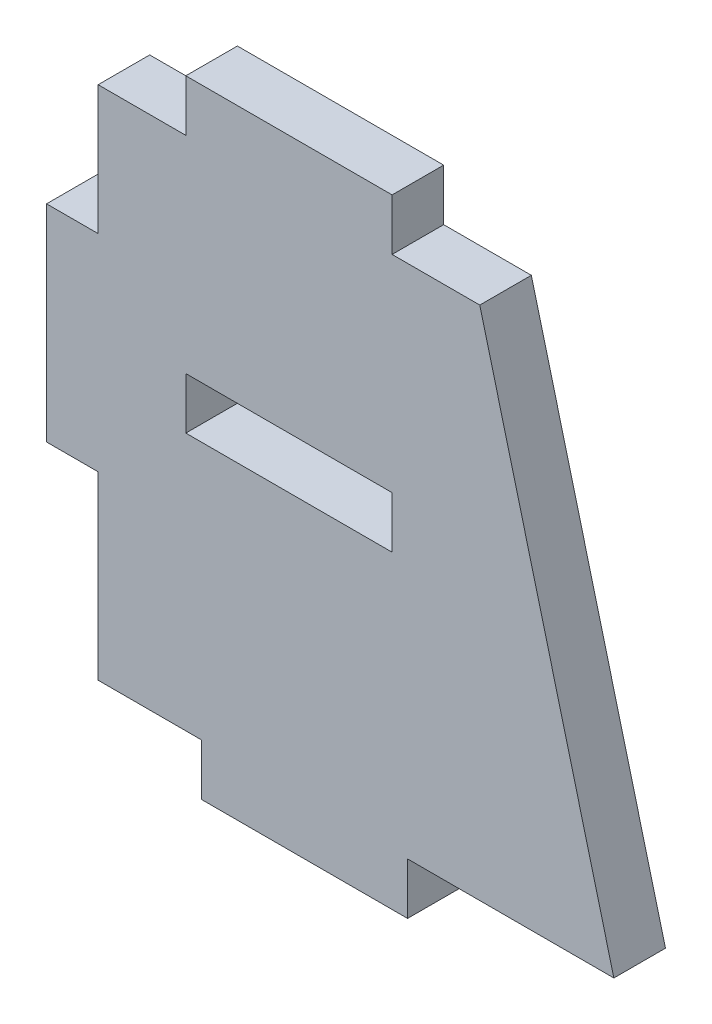
ISO-10303-21;
HEADER;
FILE_DESCRIPTION(('STEP AP214'),'2;1');
FILE_NAME('part.step','',(''),(''),'','','');
FILE_SCHEMA(('AUTOMOTIVE_DESIGN { 1 0 10303 214 1 1 1 1 }'));
ENDSEC;
DATA;
#1=APPLICATION_CONTEXT('core data for automotive mechanical design processes');
#2=APPLICATION_PROTOCOL_DEFINITION('international standard','automotive_design',2000,#1);
#3=PRODUCT_CONTEXT('',#1,'mechanical');
#4=PRODUCT('Part','Part','',(#3));
#5=PRODUCT_RELATED_PRODUCT_CATEGORY('part','',(#4));
#6=PRODUCT_DEFINITION_FORMATION('','',#4);
#7=PRODUCT_DEFINITION_CONTEXT('part definition',#1,'design');
#8=PRODUCT_DEFINITION('design','',#6,#7);
#9=PRODUCT_DEFINITION_SHAPE('','',#8);
#10=(LENGTH_UNIT() NAMED_UNIT(*) SI_UNIT(.MILLI.,.METRE.));
#11=(NAMED_UNIT(*) PLANE_ANGLE_UNIT() SI_UNIT($,.RADIAN.));
#12=(NAMED_UNIT(*) SI_UNIT($,.STERADIAN.) SOLID_ANGLE_UNIT());
#13=UNCERTAINTY_MEASURE_WITH_UNIT(LENGTH_MEASURE(1.E-05),#10,'distance_accuracy_value','');
#14=(GEOMETRIC_REPRESENTATION_CONTEXT(3) GLOBAL_UNCERTAINTY_ASSIGNED_CONTEXT((#13)) GLOBAL_UNIT_ASSIGNED_CONTEXT((#10,
#11,#12)) REPRESENTATION_CONTEXT('',''));
#15=CARTESIAN_POINT('',(0.,0.,0.));
#16=DIRECTION('',(0.,0.,1.));
#17=DIRECTION('',(1.,0.,0.));
#18=AXIS2_PLACEMENT_3D('',#15,#16,#17);
#19=CARTESIAN_POINT('',(6.35,6.35,6.35));
#20=DIRECTION('',(0.,0.,1.));
#21=DIRECTION('',(1.,0.,0.));
#22=AXIS2_PLACEMENT_3D('',#19,#20,#21);
#23=PLANE('',#22);
#24=DIRECTION('',(0.,-1.,0.));
#25=VECTOR('',#24,1.);
#26=CARTESIAN_POINT('',(6.35000000000001,28.575,6.35));
#27=LINE('',#26,#25);
#28=CARTESIAN_POINT('',(6.35000000000001,28.575,6.35));
#29=VERTEX_POINT('',#28);
#30=CARTESIAN_POINT('',(6.35,6.35,6.35));
#31=VERTEX_POINT('',#30);
#32=EDGE_CURVE('E204',#29,#31,#27,.T.);
#33=ORIENTED_EDGE('',*,*,#32,.T.);
#34=DIRECTION('',(1.,0.,0.));
#35=VECTOR('',#34,1.);
#36=CARTESIAN_POINT('',(6.35,6.35,6.35));
#37=LINE('',#36,#35);
#38=CARTESIAN_POINT('',(19.05,6.34999999999999,6.35));
#39=VERTEX_POINT('',#38);
#40=EDGE_CURVE('E207',#31,#39,#37,.T.);
#41=ORIENTED_EDGE('',*,*,#40,.T.);
#42=DIRECTION('',(0.,-1.,0.));
#43=VECTOR('',#42,1.);
#44=CARTESIAN_POINT('',(19.05,6.34999999999999,6.35));
#45=LINE('',#44,#43);
#46=CARTESIAN_POINT('',(19.05,0.,6.35));
#47=VERTEX_POINT('',#46);
#48=EDGE_CURVE('E210',#39,#47,#45,.T.);
#49=ORIENTED_EDGE('',*,*,#48,.T.);
#50=DIRECTION('',(1.,0.,0.));
#51=VECTOR('',#50,1.);
#52=CARTESIAN_POINT('',(19.05,0.,6.35));
#53=LINE('',#52,#51);
#54=CARTESIAN_POINT('',(44.45,0.,6.35));
#55=VERTEX_POINT('',#54);
#56=EDGE_CURVE('E212',#47,#55,#53,.T.);
#57=ORIENTED_EDGE('',*,*,#56,.T.);
#58=DIRECTION('',(0.,1.,0.));
#59=VECTOR('',#58,1.);
#60=CARTESIAN_POINT('',(44.45,0.,6.35));
#61=LINE('',#60,#59);
#62=CARTESIAN_POINT('',(44.45,6.35,6.35));
#63=VERTEX_POINT('',#62);
#64=EDGE_CURVE('E214',#55,#63,#61,.T.);
#65=ORIENTED_EDGE('',*,*,#64,.T.);
#66=DIRECTION('',(1.,0.,0.));
#67=VECTOR('',#66,1.);
#68=CARTESIAN_POINT('',(44.45,6.35,6.35));
#69=LINE('',#68,#67);
#70=CARTESIAN_POINT('',(69.85,6.35,6.35));
#71=VERTEX_POINT('',#70);
#72=EDGE_CURVE('E216',#63,#71,#69,.T.);
#73=ORIENTED_EDGE('',*,*,#72,.T.);
#74=DIRECTION('',(-0.251633851764951,0.967822506788272,0.));
#75=VECTOR('',#74,1.);
#76=CARTESIAN_POINT('',(69.85,6.35,6.35));
#77=LINE('',#76,#75);
#78=CARTESIAN_POINT('',(53.34,69.85,6.35));
#79=VERTEX_POINT('',#78);
#80=EDGE_CURVE('E218',#71,#79,#77,.T.);
#81=ORIENTED_EDGE('',*,*,#80,.T.);
#82=DIRECTION('',(-1.,0.,0.));
#83=VECTOR('',#82,1.);
#84=CARTESIAN_POINT('',(42.545,69.85,6.35));
#85=LINE('',#84,#83);
#86=CARTESIAN_POINT('',(42.545,69.85,6.35));
#87=VERTEX_POINT('',#86);
#88=EDGE_CURVE('E220',#79,#87,#85,.T.);
#89=ORIENTED_EDGE('',*,*,#88,.T.);
#90=DIRECTION('',(0.,1.,0.));
#91=VECTOR('',#90,1.);
#92=CARTESIAN_POINT('',(42.545,76.2,6.35));
#93=LINE('',#92,#91);
#94=CARTESIAN_POINT('',(42.545,76.2,6.35));
#95=VERTEX_POINT('',#94);
#96=EDGE_CURVE('E222',#87,#95,#93,.T.);
#97=ORIENTED_EDGE('',*,*,#96,.T.);
#98=DIRECTION('',(-1.,0.,0.));
#99=VECTOR('',#98,1.);
#100=CARTESIAN_POINT('',(17.145,76.2,6.35));
#101=LINE('',#100,#99);
#102=CARTESIAN_POINT('',(17.145,76.2,6.35));
#103=VERTEX_POINT('',#102);
#104=EDGE_CURVE('E224',#95,#103,#101,.T.);
#105=ORIENTED_EDGE('',*,*,#104,.T.);
#106=DIRECTION('',(0.,-1.,0.));
#107=VECTOR('',#106,1.);
#108=CARTESIAN_POINT('',(17.145,69.85,6.35));
#109=LINE('',#108,#107);
#110=CARTESIAN_POINT('',(17.145,69.85,6.35));
#111=VERTEX_POINT('',#110);
#112=EDGE_CURVE('E226',#103,#111,#109,.T.);
#113=ORIENTED_EDGE('',*,*,#112,.T.);
#114=DIRECTION('',(-1.,0.,0.));
#115=VECTOR('',#114,1.);
#116=CARTESIAN_POINT('',(6.34999999999999,69.85,6.35));
#117=LINE('',#116,#115);
#118=CARTESIAN_POINT('',(6.34999999999999,69.85,6.35));
#119=VERTEX_POINT('',#118);
#120=EDGE_CURVE('E228',#111,#119,#117,.T.);
#121=ORIENTED_EDGE('',*,*,#120,.T.);
#122=DIRECTION('',(0.,-1.,0.));
#123=VECTOR('',#122,1.);
#124=CARTESIAN_POINT('',(6.34999999999999,69.85,6.35));
#125=LINE('',#124,#123);
#126=CARTESIAN_POINT('',(6.35,53.975,6.35));
#127=VERTEX_POINT('',#126);
#128=EDGE_CURVE('E230',#119,#127,#125,.T.);
#129=ORIENTED_EDGE('',*,*,#128,.T.);
#130=DIRECTION('',(-1.,0.,0.));
#131=VECTOR('',#130,1.);
#132=CARTESIAN_POINT('',(0.,53.975,6.35));
#133=LINE('',#132,#131);
#134=CARTESIAN_POINT('',(0.,53.975,6.35));
#135=VERTEX_POINT('',#134);
#136=EDGE_CURVE('E232',#127,#135,#133,.T.);
#137=ORIENTED_EDGE('',*,*,#136,.T.);
#138=DIRECTION('',(0.,-1.,0.));
#139=VECTOR('',#138,1.);
#140=CARTESIAN_POINT('',(0.,28.575,6.35));
#141=LINE('',#140,#139);
#142=CARTESIAN_POINT('',(0.,28.575,6.35));
#143=VERTEX_POINT('',#142);
#144=EDGE_CURVE('E234',#135,#143,#141,.T.);
#145=ORIENTED_EDGE('',*,*,#144,.T.);
#146=DIRECTION('',(1.,0.,0.));
#147=VECTOR('',#146,1.);
#148=CARTESIAN_POINT('',(6.35000000000001,28.575,6.35));
#149=LINE('',#148,#147);
#150=EDGE_CURVE('E236',#143,#29,#149,.T.);
#151=ORIENTED_EDGE('',*,*,#150,.T.);
#152=EDGE_LOOP('',(#33,#41,#49,#57,#65,#73,#81,#89,#97,#105,#113,#121,#129,#137,#145,#151));
#153=FACE_BOUND('',#152,.T.);
#154=DIRECTION('',(1.,0.,0.));
#155=VECTOR('',#154,1.);
#156=CARTESIAN_POINT('',(17.145,38.1,6.35));
#157=LINE('',#156,#155);
#158=CARTESIAN_POINT('',(17.145,38.1,6.35));
#159=VERTEX_POINT('',#158);
#160=CARTESIAN_POINT('',(42.545,38.1,6.35));
#161=VERTEX_POINT('',#160);
#162=EDGE_CURVE('E176',#159,#161,#157,.T.);
#163=ORIENTED_EDGE('',*,*,#162,.F.);
#164=DIRECTION('',(0.,-1.,0.));
#165=VECTOR('',#164,1.);
#166=CARTESIAN_POINT('',(17.145,44.45,6.35));
#167=LINE('',#166,#165);
#168=CARTESIAN_POINT('',(17.145,44.45,6.35));
#169=VERTEX_POINT('',#168);
#170=EDGE_CURVE('E168',#169,#159,#167,.T.);
#171=ORIENTED_EDGE('',*,*,#170,.F.);
#172=DIRECTION('',(-1.,0.,0.));
#173=VECTOR('',#172,1.);
#174=CARTESIAN_POINT('',(17.145,44.45,6.35));
#175=LINE('',#174,#173);
#176=CARTESIAN_POINT('',(42.545,44.45,6.35));
#177=VERTEX_POINT('',#176);
#178=EDGE_CURVE('E190',#177,#169,#175,.T.);
#179=ORIENTED_EDGE('',*,*,#178,.F.);
#180=DIRECTION('',(0.,1.,0.));
#181=VECTOR('',#180,1.);
#182=CARTESIAN_POINT('',(42.545,44.45,6.35));
#183=LINE('',#182,#181);
#184=EDGE_CURVE('E188',#161,#177,#183,.T.);
#185=ORIENTED_EDGE('',*,*,#184,.F.);
#186=EDGE_LOOP('',(#163,#171,#179,#185));
#187=FACE_BOUND('',#186,.T.);
#188=ADVANCED_FACE('F31',(#153,#187),#23,.T.);
#189=CARTESIAN_POINT('',(6.35,6.35,0.));
#190=DIRECTION('',(0.,0.,1.));
#191=DIRECTION('',(1.,0.,0.));
#192=AXIS2_PLACEMENT_3D('',#189,#190,#191);
#193=PLANE('',#192);
#194=DIRECTION('',(0.,-1.,0.));
#195=VECTOR('',#194,1.);
#196=CARTESIAN_POINT('',(6.35000000000001,28.575,0.));
#197=LINE('',#196,#195);
#198=CARTESIAN_POINT('',(6.35000000000001,28.575,0.));
#199=VERTEX_POINT('',#198);
#200=CARTESIAN_POINT('',(6.35,6.35,0.));
#201=VERTEX_POINT('',#200);
#202=EDGE_CURVE('E184',#199,#201,#197,.T.);
#203=ORIENTED_EDGE('',*,*,#202,.F.);
#204=DIRECTION('',(1.,0.,0.));
#205=VECTOR('',#204,1.);
#206=CARTESIAN_POINT('',(6.35000000000001,28.575,0.));
#207=LINE('',#206,#205);
#208=CARTESIAN_POINT('',(0.,28.575,0.));
#209=VERTEX_POINT('',#208);
#210=EDGE_CURVE('E208',#209,#199,#207,.T.);
#211=ORIENTED_EDGE('',*,*,#210,.F.);
#212=DIRECTION('',(0.,-1.,0.));
#213=VECTOR('',#212,1.);
#214=CARTESIAN_POINT('',(0.,28.575,0.));
#215=LINE('',#214,#213);
#216=CARTESIAN_POINT('',(0.,53.975,0.));
#217=VERTEX_POINT('',#216);
#218=EDGE_CURVE('E267',#217,#209,#215,.T.);
#219=ORIENTED_EDGE('',*,*,#218,.F.);
#220=DIRECTION('',(-1.,0.,0.));
#221=VECTOR('',#220,1.);
#222=CARTESIAN_POINT('',(0.,53.975,0.));
#223=LINE('',#222,#221);
#224=CARTESIAN_POINT('',(6.35,53.975,0.));
#225=VERTEX_POINT('',#224);
#226=EDGE_CURVE('E265',#225,#217,#223,.T.);
#227=ORIENTED_EDGE('',*,*,#226,.F.);
#228=DIRECTION('',(0.,-1.,0.));
#229=VECTOR('',#228,1.);
#230=CARTESIAN_POINT('',(6.34999999999999,69.85,0.));
#231=LINE('',#230,#229);
#232=CARTESIAN_POINT('',(6.34999999999999,69.85,0.));
#233=VERTEX_POINT('',#232);
#234=EDGE_CURVE('E263',#233,#225,#231,.T.);
#235=ORIENTED_EDGE('',*,*,#234,.F.);
#236=DIRECTION('',(-1.,0.,0.));
#237=VECTOR('',#236,1.);
#238=CARTESIAN_POINT('',(6.34999999999999,69.85,0.));
#239=LINE('',#238,#237);
#240=CARTESIAN_POINT('',(17.145,69.85,0.));
#241=VERTEX_POINT('',#240);
#242=EDGE_CURVE('E261',#241,#233,#239,.T.);
#243=ORIENTED_EDGE('',*,*,#242,.F.);
#244=DIRECTION('',(0.,-1.,0.));
#245=VECTOR('',#244,1.);
#246=CARTESIAN_POINT('',(17.145,69.85,0.));
#247=LINE('',#246,#245);
#248=CARTESIAN_POINT('',(17.145,76.2,0.));
#249=VERTEX_POINT('',#248);
#250=EDGE_CURVE('E259',#249,#241,#247,.T.);
#251=ORIENTED_EDGE('',*,*,#250,.F.);
#252=DIRECTION('',(-1.,0.,0.));
#253=VECTOR('',#252,1.);
#254=CARTESIAN_POINT('',(17.145,76.2,0.));
#255=LINE('',#254,#253);
#256=CARTESIAN_POINT('',(42.545,76.2,0.));
#257=VERTEX_POINT('',#256);
#258=EDGE_CURVE('E257',#257,#249,#255,.T.);
#259=ORIENTED_EDGE('',*,*,#258,.F.);
#260=DIRECTION('',(0.,1.,0.));
#261=VECTOR('',#260,1.);
#262=CARTESIAN_POINT('',(42.545,76.2,0.));
#263=LINE('',#262,#261);
#264=CARTESIAN_POINT('',(42.545,69.85,0.));
#265=VERTEX_POINT('',#264);
#266=EDGE_CURVE('E255',#265,#257,#263,.T.);
#267=ORIENTED_EDGE('',*,*,#266,.F.);
#268=DIRECTION('',(-1.,0.,0.));
#269=VECTOR('',#268,1.);
#270=CARTESIAN_POINT('',(42.545,69.85,0.));
#271=LINE('',#270,#269);
#272=CARTESIAN_POINT('',(53.34,69.85,0.));
#273=VERTEX_POINT('',#272);
#274=EDGE_CURVE('E253',#273,#265,#271,.T.);
#275=ORIENTED_EDGE('',*,*,#274,.F.);
#276=DIRECTION('',(-0.251633851764951,0.967822506788272,0.));
#277=VECTOR('',#276,1.);
#278=CARTESIAN_POINT('',(69.85,6.35,0.));
#279=LINE('',#278,#277);
#280=CARTESIAN_POINT('',(69.85,6.35,0.));
#281=VERTEX_POINT('',#280);
#282=EDGE_CURVE('E251',#281,#273,#279,.T.);
#283=ORIENTED_EDGE('',*,*,#282,.F.);
#284=DIRECTION('',(1.,0.,0.));
#285=VECTOR('',#284,1.);
#286=CARTESIAN_POINT('',(44.45,6.35,0.));
#287=LINE('',#286,#285);
#288=CARTESIAN_POINT('',(44.45,6.35,0.));
#289=VERTEX_POINT('',#288);
#290=EDGE_CURVE('E249',#289,#281,#287,.T.);
#291=ORIENTED_EDGE('',*,*,#290,.F.);
#292=DIRECTION('',(0.,1.,0.));
#293=VECTOR('',#292,1.);
#294=CARTESIAN_POINT('',(44.45,0.,0.));
#295=LINE('',#294,#293);
#296=CARTESIAN_POINT('',(44.45,0.,0.));
#297=VERTEX_POINT('',#296);
#298=EDGE_CURVE('E247',#297,#289,#295,.T.);
#299=ORIENTED_EDGE('',*,*,#298,.F.);
#300=DIRECTION('',(1.,0.,0.));
#301=VECTOR('',#300,1.);
#302=CARTESIAN_POINT('',(19.05,0.,0.));
#303=LINE('',#302,#301);
#304=CARTESIAN_POINT('',(19.05,0.,0.));
#305=VERTEX_POINT('',#304);
#306=EDGE_CURVE('E245',#305,#297,#303,.T.);
#307=ORIENTED_EDGE('',*,*,#306,.F.);
#308=DIRECTION('',(0.,-1.,0.));
#309=VECTOR('',#308,1.);
#310=CARTESIAN_POINT('',(19.05,6.34999999999999,0.));
#311=LINE('',#310,#309);
#312=CARTESIAN_POINT('',(19.05,6.34999999999999,0.));
#313=VERTEX_POINT('',#312);
#314=EDGE_CURVE('E243',#313,#305,#311,.T.);
#315=ORIENTED_EDGE('',*,*,#314,.F.);
#316=DIRECTION('',(1.,0.,0.));
#317=VECTOR('',#316,1.);
#318=CARTESIAN_POINT('',(6.35,6.35,0.));
#319=LINE('',#318,#317);
#320=EDGE_CURVE('E241',#201,#313,#319,.T.);
#321=ORIENTED_EDGE('',*,*,#320,.F.);
#322=EDGE_LOOP('',(#203,#211,#219,#227,#235,#243,#251,#259,#267,#275,#283,#291,#299,#307,#315,#321));
#323=FACE_BOUND('',#322,.T.);
#324=DIRECTION('',(0.,-1.,0.));
#325=VECTOR('',#324,1.);
#326=CARTESIAN_POINT('',(17.145,44.45,0.));
#327=LINE('',#326,#325);
#328=CARTESIAN_POINT('',(17.145,44.45,0.));
#329=VERTEX_POINT('',#328);
#330=CARTESIAN_POINT('',(17.145,38.1,0.));
#331=VERTEX_POINT('',#330);
#332=EDGE_CURVE('E54',#329,#331,#327,.T.);
#333=ORIENTED_EDGE('',*,*,#332,.T.);
#334=DIRECTION('',(1.,0.,0.));
#335=VECTOR('',#334,1.);
#336=CARTESIAN_POINT('',(17.145,38.1,0.));
#337=LINE('',#336,#335);
#338=CARTESIAN_POINT('',(42.545,38.1,0.));
#339=VERTEX_POINT('',#338);
#340=EDGE_CURVE('E183',#331,#339,#337,.T.);
#341=ORIENTED_EDGE('',*,*,#340,.T.);
#342=DIRECTION('',(0.,1.,0.));
#343=VECTOR('',#342,1.);
#344=CARTESIAN_POINT('',(42.545,44.45,0.));
#345=LINE('',#344,#343);
#346=CARTESIAN_POINT('',(42.545,44.45,0.));
#347=VERTEX_POINT('',#346);
#348=EDGE_CURVE('E196',#339,#347,#345,.T.);
#349=ORIENTED_EDGE('',*,*,#348,.T.);
#350=DIRECTION('',(-1.,0.,0.));
#351=VECTOR('',#350,1.);
#352=CARTESIAN_POINT('',(17.145,44.45,0.));
#353=LINE('',#352,#351);
#354=EDGE_CURVE('E177',#347,#329,#353,.T.);
#355=ORIENTED_EDGE('',*,*,#354,.T.);
#356=EDGE_LOOP('',(#333,#341,#349,#355));
#357=FACE_BOUND('',#356,.T.);
#358=ADVANCED_FACE('F321',(#323,#357),#193,.F.);
#359=CARTESIAN_POINT('',(6.35000000000001,28.575,6.35));
#360=DIRECTION('',(1.,0.,0.));
#361=DIRECTION('',(0.,1.,0.));
#362=AXIS2_PLACEMENT_3D('',#359,#360,#361);
#363=PLANE('',#362);
#364=ORIENTED_EDGE('',*,*,#202,.T.);
#365=DIRECTION('',(0.,0.,-1.));
#366=VECTOR('',#365,1.);
#367=CARTESIAN_POINT('',(6.35,6.35,6.35));
#368=LINE('',#367,#366);
#369=EDGE_CURVE('E11',#31,#201,#368,.T.);
#370=ORIENTED_EDGE('',*,*,#369,.F.);
#371=ORIENTED_EDGE('',*,*,#32,.F.);
#372=DIRECTION('',(0.,0.,-1.));
#373=VECTOR('',#372,1.);
#374=CARTESIAN_POINT('',(6.35000000000001,28.575,6.35));
#375=LINE('',#374,#373);
#376=EDGE_CURVE('E238',#29,#199,#375,.T.);
#377=ORIENTED_EDGE('',*,*,#376,.T.);
#378=EDGE_LOOP('',(#364,#370,#371,#377));
#379=FACE_BOUND('',#378,.T.);
#380=ADVANCED_FACE('F33',(#379),#363,.F.);
#381=CARTESIAN_POINT('',(6.35,6.35,6.35));
#382=DIRECTION('',(0.,1.,0.));
#383=DIRECTION('',(-1.,0.,0.));
#384=AXIS2_PLACEMENT_3D('',#381,#382,#383);
#385=PLANE('',#384);
#386=ORIENTED_EDGE('',*,*,#320,.T.);
#387=DIRECTION('',(0.,0.,-1.));
#388=VECTOR('',#387,1.);
#389=CARTESIAN_POINT('',(19.05,6.34999999999999,6.35));
#390=LINE('',#389,#388);
#391=EDGE_CURVE('E39',#39,#313,#390,.T.);
#392=ORIENTED_EDGE('',*,*,#391,.F.);
#393=ORIENTED_EDGE('',*,*,#40,.F.);
#394=ORIENTED_EDGE('',*,*,#369,.T.);
#395=EDGE_LOOP('',(#386,#392,#393,#394));
#396=FACE_BOUND('',#395,.T.);
#397=ADVANCED_FACE('F338',(#396),#385,.F.);
#398=CARTESIAN_POINT('',(19.05,6.34999999999999,6.35));
#399=DIRECTION('',(1.,0.,0.));
#400=DIRECTION('',(0.,0.,-1.));
#401=AXIS2_PLACEMENT_3D('',#398,#399,#400);
#402=PLANE('',#401);
#403=ORIENTED_EDGE('',*,*,#314,.T.);
#404=DIRECTION('',(0.,0.,-1.));
#405=VECTOR('',#404,1.);
#406=CARTESIAN_POINT('',(19.05,0.,6.35));
#407=LINE('',#406,#405);
#408=EDGE_CURVE('E308',#47,#305,#407,.T.);
#409=ORIENTED_EDGE('',*,*,#408,.F.);
#410=ORIENTED_EDGE('',*,*,#48,.F.);
#411=ORIENTED_EDGE('',*,*,#391,.T.);
#412=EDGE_LOOP('',(#403,#409,#410,#411));
#413=FACE_BOUND('',#412,.T.);
#414=ADVANCED_FACE('F315',(#413),#402,.F.);
#415=CARTESIAN_POINT('',(19.05,0.,6.35));
#416=DIRECTION('',(0.,1.,0.));
#417=DIRECTION('',(-1.,0.,0.));
#418=AXIS2_PLACEMENT_3D('',#415,#416,#417);
#419=PLANE('',#418);
#420=ORIENTED_EDGE('',*,*,#306,.T.);
#421=DIRECTION('',(0.,0.,-1.));
#422=VECTOR('',#421,1.);
#423=CARTESIAN_POINT('',(44.45,0.,6.35));
#424=LINE('',#423,#422);
#425=EDGE_CURVE('E305',#55,#297,#424,.T.);
#426=ORIENTED_EDGE('',*,*,#425,.F.);
#427=ORIENTED_EDGE('',*,*,#56,.F.);
#428=ORIENTED_EDGE('',*,*,#408,.T.);
#429=EDGE_LOOP('',(#420,#426,#427,#428));
#430=FACE_BOUND('',#429,.T.);
#431=ADVANCED_FACE('F327',(#430),#419,.F.);
#432=CARTESIAN_POINT('',(44.45,0.,6.35));
#433=DIRECTION('',(-1.,0.,0.));
#434=DIRECTION('',(0.,0.,1.));
#435=AXIS2_PLACEMENT_3D('',#432,#433,#434);
#436=PLANE('',#435);
#437=ORIENTED_EDGE('',*,*,#298,.T.);
#438=DIRECTION('',(0.,0.,-1.));
#439=VECTOR('',#438,1.);
#440=CARTESIAN_POINT('',(44.45,6.35,6.35));
#441=LINE('',#440,#439);
#442=EDGE_CURVE('E302',#63,#289,#441,.T.);
#443=ORIENTED_EDGE('',*,*,#442,.F.);
#444=ORIENTED_EDGE('',*,*,#64,.F.);
#445=ORIENTED_EDGE('',*,*,#425,.T.);
#446=EDGE_LOOP('',(#437,#443,#444,#445));
#447=FACE_BOUND('',#446,.T.);
#448=ADVANCED_FACE('F331',(#447),#436,.F.);
#449=CARTESIAN_POINT('',(44.45,6.35,6.35));
#450=DIRECTION('',(0.,1.,0.));
#451=DIRECTION('',(0.,0.,1.));
#452=AXIS2_PLACEMENT_3D('',#449,#450,#451);
#453=PLANE('',#452);
#454=ORIENTED_EDGE('',*,*,#290,.T.);
#455=DIRECTION('',(0.,0.,-1.));
#456=VECTOR('',#455,1.);
#457=CARTESIAN_POINT('',(69.85,6.35,6.35));
#458=LINE('',#457,#456);
#459=EDGE_CURVE('E299',#71,#281,#458,.T.);
#460=ORIENTED_EDGE('',*,*,#459,.F.);
#461=ORIENTED_EDGE('',*,*,#72,.F.);
#462=ORIENTED_EDGE('',*,*,#442,.T.);
#463=EDGE_LOOP('',(#454,#460,#461,#462));
#464=FACE_BOUND('',#463,.T.);
#465=ADVANCED_FACE('F391',(#464),#453,.F.);
#466=CARTESIAN_POINT('',(69.85,6.35,6.35));
#467=DIRECTION('',(-0.967822506788272,-0.251633851764951,0.));
#468=DIRECTION('',(0.251633851764951,-0.967822506788272,0.));
#469=AXIS2_PLACEMENT_3D('',#466,#467,#468);
#470=PLANE('',#469);
#471=ORIENTED_EDGE('',*,*,#282,.T.);
#472=DIRECTION('',(0.,0.,-1.));
#473=VECTOR('',#472,1.);
#474=CARTESIAN_POINT('',(53.34,69.85,6.35));
#475=LINE('',#474,#473);
#476=EDGE_CURVE('E296',#79,#273,#475,.T.);
#477=ORIENTED_EDGE('',*,*,#476,.F.);
#478=ORIENTED_EDGE('',*,*,#80,.F.);
#479=ORIENTED_EDGE('',*,*,#459,.T.);
#480=EDGE_LOOP('',(#471,#477,#478,#479));
#481=FACE_BOUND('',#480,.T.);
#482=ADVANCED_FACE('F388',(#481),#470,.F.);
#483=CARTESIAN_POINT('',(42.545,69.85,6.35));
#484=DIRECTION('',(0.,-1.,0.));
#485=DIRECTION('',(0.,0.,-1.));
#486=AXIS2_PLACEMENT_3D('',#483,#484,#485);
#487=PLANE('',#486);
#488=ORIENTED_EDGE('',*,*,#274,.T.);
#489=DIRECTION('',(0.,0.,-1.));
#490=VECTOR('',#489,1.);
#491=CARTESIAN_POINT('',(42.545,69.85,6.35));
#492=LINE('',#491,#490);
#493=EDGE_CURVE('E293',#87,#265,#492,.T.);
#494=ORIENTED_EDGE('',*,*,#493,.F.);
#495=ORIENTED_EDGE('',*,*,#88,.F.);
#496=ORIENTED_EDGE('',*,*,#476,.T.);
#497=EDGE_LOOP('',(#488,#494,#495,#496));
#498=FACE_BOUND('',#497,.T.);
#499=ADVANCED_FACE('F384',(#498),#487,.F.);
#500=CARTESIAN_POINT('',(42.545,76.2,6.35));
#501=DIRECTION('',(-1.,0.,0.));
#502=DIRECTION('',(0.,0.,1.));
#503=AXIS2_PLACEMENT_3D('',#500,#501,#502);
#504=PLANE('',#503);
#505=ORIENTED_EDGE('',*,*,#266,.T.);
#506=DIRECTION('',(0.,0.,-1.));
#507=VECTOR('',#506,1.);
#508=CARTESIAN_POINT('',(42.545,76.2,6.35));
#509=LINE('',#508,#507);
#510=EDGE_CURVE('E290',#95,#257,#509,.T.);
#511=ORIENTED_EDGE('',*,*,#510,.F.);
#512=ORIENTED_EDGE('',*,*,#96,.F.);
#513=ORIENTED_EDGE('',*,*,#493,.T.);
#514=EDGE_LOOP('',(#505,#511,#512,#513));
#515=FACE_BOUND('',#514,.T.);
#516=ADVANCED_FACE('F380',(#515),#504,.F.);
#517=CARTESIAN_POINT('',(17.145,76.2,6.35));
#518=DIRECTION('',(0.,-1.,0.));
#519=DIRECTION('',(0.,0.,-1.));
#520=AXIS2_PLACEMENT_3D('',#517,#518,#519);
#521=PLANE('',#520);
#522=ORIENTED_EDGE('',*,*,#258,.T.);
#523=DIRECTION('',(0.,0.,-1.));
#524=VECTOR('',#523,1.);
#525=CARTESIAN_POINT('',(17.145,76.2,6.35));
#526=LINE('',#525,#524);
#527=EDGE_CURVE('E287',#103,#249,#526,.T.);
#528=ORIENTED_EDGE('',*,*,#527,.F.);
#529=ORIENTED_EDGE('',*,*,#104,.F.);
#530=ORIENTED_EDGE('',*,*,#510,.T.);
#531=EDGE_LOOP('',(#522,#528,#529,#530));
#532=FACE_BOUND('',#531,.T.);
#533=ADVANCED_FACE('F375',(#532),#521,.F.);
#534=CARTESIAN_POINT('',(17.145,69.85,6.35));
#535=DIRECTION('',(1.,0.,0.));
#536=DIRECTION('',(0.,0.,-1.));
#537=AXIS2_PLACEMENT_3D('',#534,#535,#536);
#538=PLANE('',#537);
#539=ORIENTED_EDGE('',*,*,#250,.T.);
#540=DIRECTION('',(0.,0.,-1.));
#541=VECTOR('',#540,1.);
#542=CARTESIAN_POINT('',(17.145,69.85,6.35));
#543=LINE('',#542,#541);
#544=EDGE_CURVE('E284',#111,#241,#543,.T.);
#545=ORIENTED_EDGE('',*,*,#544,.F.);
#546=ORIENTED_EDGE('',*,*,#112,.F.);
#547=ORIENTED_EDGE('',*,*,#527,.T.);
#548=EDGE_LOOP('',(#539,#545,#546,#547));
#549=FACE_BOUND('',#548,.T.);
#550=ADVANCED_FACE('F369',(#549),#538,.F.);
#551=CARTESIAN_POINT('',(6.34999999999999,69.85,6.35));
#552=DIRECTION('',(0.,-1.,0.));
#553=DIRECTION('',(0.,0.,-1.));
#554=AXIS2_PLACEMENT_3D('',#551,#552,#553);
#555=PLANE('',#554);
#556=ORIENTED_EDGE('',*,*,#242,.T.);
#557=DIRECTION('',(0.,0.,-1.));
#558=VECTOR('',#557,1.);
#559=CARTESIAN_POINT('',(6.34999999999999,69.85,6.35));
#560=LINE('',#559,#558);
#561=EDGE_CURVE('E281',#119,#233,#560,.T.);
#562=ORIENTED_EDGE('',*,*,#561,.F.);
#563=ORIENTED_EDGE('',*,*,#120,.F.);
#564=ORIENTED_EDGE('',*,*,#544,.T.);
#565=EDGE_LOOP('',(#556,#562,#563,#564));
#566=FACE_BOUND('',#565,.T.);
#567=ADVANCED_FACE('F365',(#566),#555,.F.);
#568=CARTESIAN_POINT('',(6.34999999999999,69.85,6.35));
#569=DIRECTION('',(1.,0.,0.));
#570=DIRECTION('',(0.,1.,0.));
#571=AXIS2_PLACEMENT_3D('',#568,#569,#570);
#572=PLANE('',#571);
#573=ORIENTED_EDGE('',*,*,#234,.T.);
#574=DIRECTION('',(0.,0.,-1.));
#575=VECTOR('',#574,1.);
#576=CARTESIAN_POINT('',(6.35,53.975,6.35));
#577=LINE('',#576,#575);
#578=EDGE_CURVE('E278',#127,#225,#577,.T.);
#579=ORIENTED_EDGE('',*,*,#578,.F.);
#580=ORIENTED_EDGE('',*,*,#128,.F.);
#581=ORIENTED_EDGE('',*,*,#561,.T.);
#582=EDGE_LOOP('',(#573,#579,#580,#581));
#583=FACE_BOUND('',#582,.T.);
#584=ADVANCED_FACE('F360',(#583),#572,.F.);
#585=CARTESIAN_POINT('',(0.,53.975,6.35));
#586=DIRECTION('',(0.,-1.,0.));
#587=DIRECTION('',(0.,0.,-1.));
#588=AXIS2_PLACEMENT_3D('',#585,#586,#587);
#589=PLANE('',#588);
#590=ORIENTED_EDGE('',*,*,#226,.T.);
#591=DIRECTION('',(0.,0.,-1.));
#592=VECTOR('',#591,1.);
#593=CARTESIAN_POINT('',(0.,53.975,6.35));
#594=LINE('',#593,#592);
#595=EDGE_CURVE('E275',#135,#217,#594,.T.);
#596=ORIENTED_EDGE('',*,*,#595,.F.);
#597=ORIENTED_EDGE('',*,*,#136,.F.);
#598=ORIENTED_EDGE('',*,*,#578,.T.);
#599=EDGE_LOOP('',(#590,#596,#597,#598));
#600=FACE_BOUND('',#599,.T.);
#601=ADVANCED_FACE('F354',(#600),#589,.F.);
#602=CARTESIAN_POINT('',(0.,28.575,6.35));
#603=DIRECTION('',(1.,0.,0.));
#604=DIRECTION('',(0.,1.,0.));
#605=AXIS2_PLACEMENT_3D('',#602,#603,#604);
#606=PLANE('',#605);
#607=ORIENTED_EDGE('',*,*,#218,.T.);
#608=DIRECTION('',(0.,0.,-1.));
#609=VECTOR('',#608,1.);
#610=CARTESIAN_POINT('',(0.,28.575,6.35));
#611=LINE('',#610,#609);
#612=EDGE_CURVE('E272',#143,#209,#611,.T.);
#613=ORIENTED_EDGE('',*,*,#612,.F.);
#614=ORIENTED_EDGE('',*,*,#144,.F.);
#615=ORIENTED_EDGE('',*,*,#595,.T.);
#616=EDGE_LOOP('',(#607,#613,#614,#615));
#617=FACE_BOUND('',#616,.T.);
#618=ADVANCED_FACE('F350',(#617),#606,.F.);
#619=CARTESIAN_POINT('',(6.35000000000001,28.575,6.35));
#620=DIRECTION('',(0.,1.,0.));
#621=DIRECTION('',(0.,0.,1.));
#622=AXIS2_PLACEMENT_3D('',#619,#620,#621);
#623=PLANE('',#622);
#624=ORIENTED_EDGE('',*,*,#210,.T.);
#625=ORIENTED_EDGE('',*,*,#376,.F.);
#626=ORIENTED_EDGE('',*,*,#150,.F.);
#627=ORIENTED_EDGE('',*,*,#612,.T.);
#628=EDGE_LOOP('',(#624,#625,#626,#627));
#629=FACE_BOUND('',#628,.T.);
#630=ADVANCED_FACE('F345',(#629),#623,.F.);
#631=CARTESIAN_POINT('',(17.145,44.45,6.35));
#632=DIRECTION('',(1.,0.,0.));
#633=DIRECTION('',(0.,0.,-1.));
#634=AXIS2_PLACEMENT_3D('',#631,#632,#633);
#635=PLANE('',#634);
#636=ORIENTED_EDGE('',*,*,#332,.F.);
#637=DIRECTION('',(0.,0.,-1.));
#638=VECTOR('',#637,1.);
#639=CARTESIAN_POINT('',(17.145,44.45,6.35));
#640=LINE('',#639,#638);
#641=EDGE_CURVE('E172',#169,#329,#640,.T.);
#642=ORIENTED_EDGE('',*,*,#641,.F.);
#643=ORIENTED_EDGE('',*,*,#170,.T.);
#644=DIRECTION('',(0.,0.,-1.));
#645=VECTOR('',#644,1.);
#646=CARTESIAN_POINT('',(17.145,38.1,6.35));
#647=LINE('',#646,#645);
#648=EDGE_CURVE('E171',#159,#331,#647,.T.);
#649=ORIENTED_EDGE('',*,*,#648,.T.);
#650=EDGE_LOOP('',(#636,#642,#643,#649));
#651=FACE_BOUND('',#650,.T.);
#652=ADVANCED_FACE('F170',(#651),#635,.T.);
#653=CARTESIAN_POINT('',(17.145,38.1,6.35));
#654=DIRECTION('',(0.,1.,0.));
#655=DIRECTION('',(0.,0.,1.));
#656=AXIS2_PLACEMENT_3D('',#653,#654,#655);
#657=PLANE('',#656);
#658=ORIENTED_EDGE('',*,*,#340,.F.);
#659=ORIENTED_EDGE('',*,*,#648,.F.);
#660=ORIENTED_EDGE('',*,*,#162,.T.);
#661=DIRECTION('',(0.,0.,-1.));
#662=VECTOR('',#661,1.);
#663=CARTESIAN_POINT('',(42.545,38.1,6.35));
#664=LINE('',#663,#662);
#665=EDGE_CURVE('E185',#161,#339,#664,.T.);
#666=ORIENTED_EDGE('',*,*,#665,.T.);
#667=EDGE_LOOP('',(#658,#659,#660,#666));
#668=FACE_BOUND('',#667,.T.);
#669=ADVANCED_FACE('F180',(#668),#657,.T.);
#670=CARTESIAN_POINT('',(42.545,44.45,6.35));
#671=DIRECTION('',(-1.,0.,0.));
#672=DIRECTION('',(0.,0.,1.));
#673=AXIS2_PLACEMENT_3D('',#670,#671,#672);
#674=PLANE('',#673);
#675=ORIENTED_EDGE('',*,*,#348,.F.);
#676=ORIENTED_EDGE('',*,*,#665,.F.);
#677=ORIENTED_EDGE('',*,*,#184,.T.);
#678=DIRECTION('',(0.,0.,-1.));
#679=VECTOR('',#678,1.);
#680=CARTESIAN_POINT('',(42.545,44.45,6.35));
#681=LINE('',#680,#679);
#682=EDGE_CURVE('E46',#177,#347,#681,.T.);
#683=ORIENTED_EDGE('',*,*,#682,.T.);
#684=EDGE_LOOP('',(#675,#676,#677,#683));
#685=FACE_BOUND('',#684,.T.);
#686=ADVANCED_FACE('F473',(#685),#674,.T.);
#687=CARTESIAN_POINT('',(17.145,44.45,6.35));
#688=DIRECTION('',(0.,-1.,0.));
#689=DIRECTION('',(0.,0.,-1.));
#690=AXIS2_PLACEMENT_3D('',#687,#688,#689);
#691=PLANE('',#690);
#692=ORIENTED_EDGE('',*,*,#354,.F.);
#693=ORIENTED_EDGE('',*,*,#682,.F.);
#694=ORIENTED_EDGE('',*,*,#178,.T.);
#695=ORIENTED_EDGE('',*,*,#641,.T.);
#696=EDGE_LOOP('',(#692,#693,#694,#695));
#697=FACE_BOUND('',#696,.T.);
#698=ADVANCED_FACE('F479',(#697),#691,.T.);
#699=CLOSED_SHELL('',(#188,#358,#380,#397,#414,#431,#448,#465,#482,#499,#516,#533,#550,#567,
#584,#601,#618,#630,#652,#669,#686,#698));
#700=MANIFOLD_SOLID_BREP('B2',#699);
#701=ADVANCED_BREP_SHAPE_REPRESENTATION('',(#18,#700),#14);
#702=SHAPE_DEFINITION_REPRESENTATION(#9,#701);
ENDSEC;
END-ISO-10303-21;
